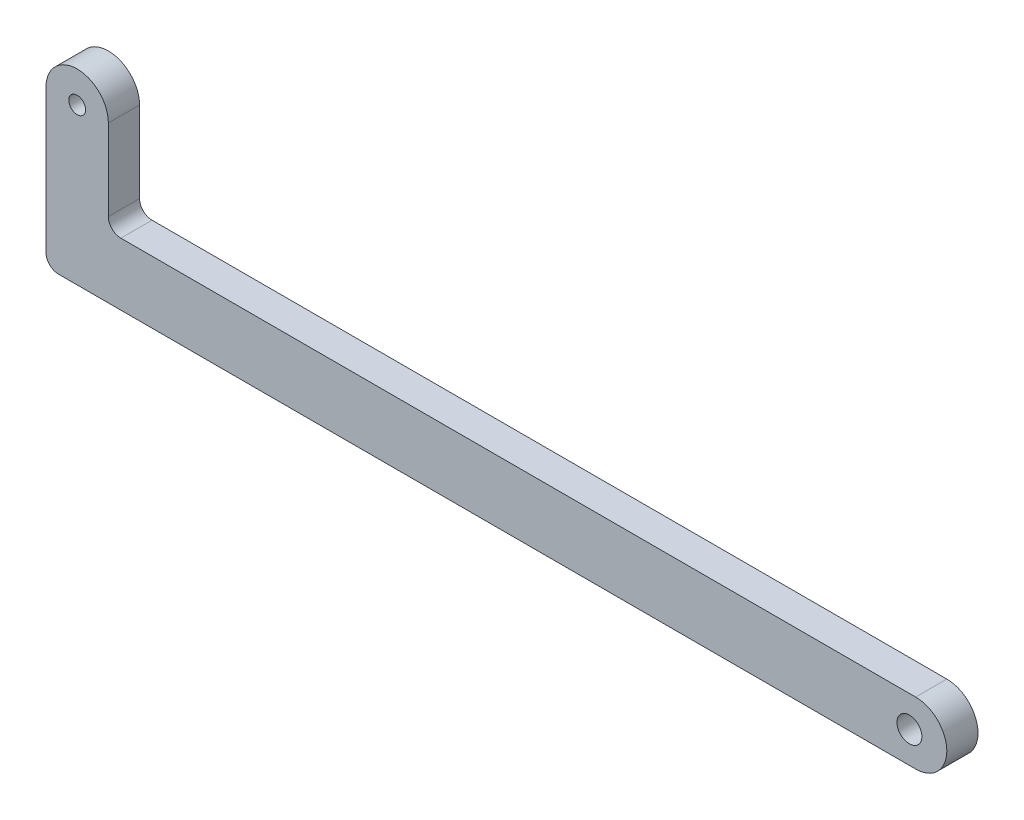
ISO-10303-21;
HEADER;
FILE_DESCRIPTION(('STEP AP214'),'2;1');
FILE_NAME('part.step','',(''),(''),'','','');
FILE_SCHEMA(('AUTOMOTIVE_DESIGN { 1 0 10303 214 1 1 1 1 }'));
ENDSEC;
DATA;
#1=APPLICATION_CONTEXT('core data for automotive mechanical design processes');
#2=APPLICATION_PROTOCOL_DEFINITION('international standard','automotive_design',2000,#1);
#3=PRODUCT_CONTEXT('',#1,'mechanical');
#4=PRODUCT('Part','Part','',(#3));
#5=PRODUCT_RELATED_PRODUCT_CATEGORY('part','',(#4));
#6=PRODUCT_DEFINITION_FORMATION('','',#4);
#7=PRODUCT_DEFINITION_CONTEXT('part definition',#1,'design');
#8=PRODUCT_DEFINITION('design','',#6,#7);
#9=PRODUCT_DEFINITION_SHAPE('','',#8);
#10=(LENGTH_UNIT() NAMED_UNIT(*) SI_UNIT(.MILLI.,.METRE.));
#11=(NAMED_UNIT(*) PLANE_ANGLE_UNIT() SI_UNIT($,.RADIAN.));
#12=(NAMED_UNIT(*) SI_UNIT($,.STERADIAN.) SOLID_ANGLE_UNIT());
#13=UNCERTAINTY_MEASURE_WITH_UNIT(LENGTH_MEASURE(1.E-05),#10,'distance_accuracy_value','');
#14=(GEOMETRIC_REPRESENTATION_CONTEXT(3) GLOBAL_UNCERTAINTY_ASSIGNED_CONTEXT((#13)) GLOBAL_UNIT_ASSIGNED_CONTEXT((#10,
#11,#12)) REPRESENTATION_CONTEXT('',''));
#15=CARTESIAN_POINT('',(0.,0.,0.));
#16=DIRECTION('',(0.,0.,1.));
#17=DIRECTION('',(1.,0.,0.));
#18=AXIS2_PLACEMENT_3D('',#15,#16,#17);
#19=CARTESIAN_POINT('',(12.,10.,5.));
#20=DIRECTION('',(0.,0.,-1.));
#21=DIRECTION('',(-1.,0.,0.));
#22=AXIS2_PLACEMENT_3D('',#19,#20,#21);
#23=PLANE('',#22);
#24=CARTESIAN_POINT('',(138.46079057,3.00000000000003,5.));
#25=DIRECTION('',(0.,0.,1.));
#26=DIRECTION('',(1.,0.,0.));
#27=AXIS2_PLACEMENT_3D('',#24,#25,#26);
#28=CIRCLE('',#27,2.);
#29=CARTESIAN_POINT('',(140.46079057,3.00000000000003,5.));
#30=VERTEX_POINT('',#29);
#31=EDGE_CURVE('E185',#30,#30,#28,.T.);
#32=ORIENTED_EDGE('',*,*,#31,.F.);
#33=EDGE_LOOP('',(#32));
#34=FACE_BOUND('',#33,.T.);
#35=CARTESIAN_POINT('',(12.,10.,5.));
#36=DIRECTION('',(0.,0.,-1.));
#37=DIRECTION('',(-1.,0.,0.));
#38=AXIS2_PLACEMENT_3D('',#35,#36,#37);
#39=CIRCLE('',#38,2.);
#40=CARTESIAN_POINT('',(12.,8.00000000000001,5.));
#41=VERTEX_POINT('',#40);
#42=CARTESIAN_POINT('',(9.99999999999999,10.,5.));
#43=VERTEX_POINT('',#42);
#44=EDGE_CURVE('E145',#41,#43,#39,.T.);
#45=ORIENTED_EDGE('',*,*,#44,.T.);
#46=DIRECTION('',(0.,1.,0.));
#47=VECTOR('',#46,1.);
#48=CARTESIAN_POINT('',(9.99999999999999,10.,5.));
#49=LINE('',#48,#47);
#50=CARTESIAN_POINT('',(9.99999999999999,23.,5.));
#51=VERTEX_POINT('',#50);
#52=EDGE_CURVE('E93',#43,#51,#49,.T.);
#53=ORIENTED_EDGE('',*,*,#52,.T.);
#54=CARTESIAN_POINT('',(4.99999999999999,23.,5.));
#55=DIRECTION('',(0.,0.,1.));
#56=DIRECTION('',(1.,0.,0.));
#57=AXIS2_PLACEMENT_3D('',#54,#55,#56);
#58=CIRCLE('',#57,5.);
#59=CARTESIAN_POINT('',(0.,23.,5.));
#60=VERTEX_POINT('',#59);
#61=EDGE_CURVE('E160',#51,#60,#58,.T.);
#62=ORIENTED_EDGE('',*,*,#61,.T.);
#63=DIRECTION('',(0.,-1.,0.));
#64=VECTOR('',#63,1.);
#65=CARTESIAN_POINT('',(0.,0.,5.));
#66=LINE('',#65,#64);
#67=CARTESIAN_POINT('',(0.,0.,5.));
#68=VERTEX_POINT('',#67);
#69=EDGE_CURVE('E173',#60,#68,#66,.T.);
#70=ORIENTED_EDGE('',*,*,#69,.T.);
#71=CARTESIAN_POINT('',(2.,0.,5.));
#72=DIRECTION('',(0.,0.,1.));
#73=DIRECTION('',(-1.,0.,0.));
#74=AXIS2_PLACEMENT_3D('',#71,#72,#73);
#75=CIRCLE('',#74,2.);
#76=CARTESIAN_POINT('',(2.,-2.,5.));
#77=VERTEX_POINT('',#76);
#78=EDGE_CURVE('E112',#68,#77,#75,.T.);
#79=ORIENTED_EDGE('',*,*,#78,.T.);
#80=DIRECTION('',(1.,0.,0.));
#81=VECTOR('',#80,1.);
#82=CARTESIAN_POINT('',(2.,-2.,5.));
#83=LINE('',#82,#81);
#84=CARTESIAN_POINT('',(139.46079057,-1.99999999999997,5.));
#85=VERTEX_POINT('',#84);
#86=EDGE_CURVE('E106',#77,#85,#83,.T.);
#87=ORIENTED_EDGE('',*,*,#86,.T.);
#88=CARTESIAN_POINT('',(139.46079057,3.00000000000003,5.));
#89=DIRECTION('',(0.,0.,1.));
#90=DIRECTION('',(1.,0.,0.));
#91=AXIS2_PLACEMENT_3D('',#88,#89,#90);
#92=CIRCLE('',#91,5.);
#93=CARTESIAN_POINT('',(139.46079057,8.00000000000003,5.));
#94=VERTEX_POINT('',#93);
#95=EDGE_CURVE('E110',#85,#94,#92,.T.);
#96=ORIENTED_EDGE('',*,*,#95,.T.);
#97=DIRECTION('',(-1.,0.,0.));
#98=VECTOR('',#97,1.);
#99=CARTESIAN_POINT('',(139.46079057,8.00000000000003,5.));
#100=LINE('',#99,#98);
#101=EDGE_CURVE('E50',#94,#41,#100,.T.);
#102=ORIENTED_EDGE('',*,*,#101,.T.);
#103=EDGE_LOOP('',(#45,#53,#62,#70,#79,#87,#96,#102));
#104=FACE_BOUND('',#103,.T.);
#105=CARTESIAN_POINT('',(4.99999999999999,23.,5.));
#106=DIRECTION('',(0.,0.,1.));
#107=DIRECTION('',(1.,0.,0.));
#108=AXIS2_PLACEMENT_3D('',#105,#106,#107);
#109=CIRCLE('',#108,1.35);
#110=CARTESIAN_POINT('',(6.35,23.,5.));
#111=VERTEX_POINT('',#110);
#112=EDGE_CURVE('E134',#111,#111,#109,.T.);
#113=ORIENTED_EDGE('',*,*,#112,.F.);
#114=EDGE_LOOP('',(#113));
#115=FACE_BOUND('',#114,.T.);
#116=ADVANCED_FACE('F33',(#34,#104,#115),#23,.F.);
#117=CARTESIAN_POINT('',(12.,10.,0.));
#118=DIRECTION('',(0.,0.,-1.));
#119=DIRECTION('',(-1.,0.,0.));
#120=AXIS2_PLACEMENT_3D('',#117,#118,#119);
#121=PLANE('',#120);
#122=CARTESIAN_POINT('',(138.46079057,3.00000000000003,0.));
#123=DIRECTION('',(0.,0.,1.));
#124=DIRECTION('',(1.,0.,0.));
#125=AXIS2_PLACEMENT_3D('',#122,#123,#124);
#126=CIRCLE('',#125,2.);
#127=CARTESIAN_POINT('',(140.46079057,3.00000000000003,0.));
#128=VERTEX_POINT('',#127);
#129=EDGE_CURVE('E182',#128,#128,#126,.T.);
#130=ORIENTED_EDGE('',*,*,#129,.T.);
#131=EDGE_LOOP('',(#130));
#132=FACE_BOUND('',#131,.T.);
#133=CARTESIAN_POINT('',(12.,10.,0.));
#134=DIRECTION('',(0.,0.,-1.));
#135=DIRECTION('',(-1.,0.,0.));
#136=AXIS2_PLACEMENT_3D('',#133,#134,#135);
#137=CIRCLE('',#136,2.);
#138=CARTESIAN_POINT('',(12.,8.00000000000001,0.));
#139=VERTEX_POINT('',#138);
#140=CARTESIAN_POINT('',(9.99999999999999,10.,0.));
#141=VERTEX_POINT('',#140);
#142=EDGE_CURVE('E130',#139,#141,#137,.T.);
#143=ORIENTED_EDGE('',*,*,#142,.F.);
#144=DIRECTION('',(-1.,0.,0.));
#145=VECTOR('',#144,1.);
#146=CARTESIAN_POINT('',(139.46079057,8.00000000000003,0.));
#147=LINE('',#146,#145);
#148=CARTESIAN_POINT('',(139.46079057,8.00000000000003,0.));
#149=VERTEX_POINT('',#148);
#150=EDGE_CURVE('E85',#149,#139,#147,.T.);
#151=ORIENTED_EDGE('',*,*,#150,.F.);
#152=CARTESIAN_POINT('',(139.46079057,3.00000000000003,0.));
#153=DIRECTION('',(0.,0.,1.));
#154=DIRECTION('',(1.,0.,0.));
#155=AXIS2_PLACEMENT_3D('',#152,#153,#154);
#156=CIRCLE('',#155,5.);
#157=CARTESIAN_POINT('',(139.46079057,-1.99999999999997,0.));
#158=VERTEX_POINT('',#157);
#159=EDGE_CURVE('E79',#158,#149,#156,.T.);
#160=ORIENTED_EDGE('',*,*,#159,.F.);
#161=DIRECTION('',(1.,0.,0.));
#162=VECTOR('',#161,1.);
#163=CARTESIAN_POINT('',(2.,-2.,0.));
#164=LINE('',#163,#162);
#165=CARTESIAN_POINT('',(2.,-2.,0.));
#166=VERTEX_POINT('',#165);
#167=EDGE_CURVE('E120',#166,#158,#164,.T.);
#168=ORIENTED_EDGE('',*,*,#167,.F.);
#169=CARTESIAN_POINT('',(2.,0.,0.));
#170=DIRECTION('',(0.,0.,1.));
#171=DIRECTION('',(-1.,0.,0.));
#172=AXIS2_PLACEMENT_3D('',#169,#170,#171);
#173=CIRCLE('',#172,2.);
#174=CARTESIAN_POINT('',(0.,0.,0.));
#175=VERTEX_POINT('',#174);
#176=EDGE_CURVE('E140',#175,#166,#173,.T.);
#177=ORIENTED_EDGE('',*,*,#176,.F.);
#178=DIRECTION('',(0.,-1.,0.));
#179=VECTOR('',#178,1.);
#180=CARTESIAN_POINT('',(0.,0.,0.));
#181=LINE('',#180,#179);
#182=CARTESIAN_POINT('',(0.,23.,0.));
#183=VERTEX_POINT('',#182);
#184=EDGE_CURVE('E138',#183,#175,#181,.T.);
#185=ORIENTED_EDGE('',*,*,#184,.F.);
#186=CARTESIAN_POINT('',(4.99999999999999,23.,0.));
#187=DIRECTION('',(0.,0.,1.));
#188=DIRECTION('',(1.,0.,0.));
#189=AXIS2_PLACEMENT_3D('',#186,#187,#188);
#190=CIRCLE('',#189,5.);
#191=CARTESIAN_POINT('',(9.99999999999999,23.,0.));
#192=VERTEX_POINT('',#191);
#193=EDGE_CURVE('E136',#192,#183,#190,.T.);
#194=ORIENTED_EDGE('',*,*,#193,.F.);
#195=DIRECTION('',(0.,1.,0.));
#196=VECTOR('',#195,1.);
#197=CARTESIAN_POINT('',(9.99999999999999,10.,0.));
#198=LINE('',#197,#196);
#199=EDGE_CURVE('E133',#141,#192,#198,.T.);
#200=ORIENTED_EDGE('',*,*,#199,.F.);
#201=EDGE_LOOP('',(#143,#151,#160,#168,#177,#185,#194,#200));
#202=FACE_BOUND('',#201,.T.);
#203=CARTESIAN_POINT('',(4.99999999999999,23.,0.));
#204=DIRECTION('',(0.,0.,1.));
#205=DIRECTION('',(1.,0.,0.));
#206=AXIS2_PLACEMENT_3D('',#203,#204,#205);
#207=CIRCLE('',#206,1.35);
#208=CARTESIAN_POINT('',(6.35,23.,0.));
#209=VERTEX_POINT('',#208);
#210=EDGE_CURVE('E179',#209,#209,#207,.T.);
#211=ORIENTED_EDGE('',*,*,#210,.T.);
#212=EDGE_LOOP('',(#211));
#213=FACE_BOUND('',#212,.T.);
#214=ADVANCED_FACE('F164',(#132,#202,#213),#121,.T.);
#215=CARTESIAN_POINT('',(12.,10.,5.));
#216=DIRECTION('',(0.,0.,-1.));
#217=DIRECTION('',(-1.,0.,0.));
#218=AXIS2_PLACEMENT_3D('',#215,#216,#217);
#219=CYLINDRICAL_SURFACE('',#218,2.);
#220=ORIENTED_EDGE('',*,*,#142,.T.);
#221=DIRECTION('',(0.,0.,-1.));
#222=VECTOR('',#221,1.);
#223=CARTESIAN_POINT('',(9.99999999999999,10.,5.));
#224=LINE('',#223,#222);
#225=EDGE_CURVE('E11',#43,#141,#224,.T.);
#226=ORIENTED_EDGE('',*,*,#225,.F.);
#227=ORIENTED_EDGE('',*,*,#44,.F.);
#228=DIRECTION('',(0.,0.,-1.));
#229=VECTOR('',#228,1.);
#230=CARTESIAN_POINT('',(12.,8.00000000000001,5.));
#231=LINE('',#230,#229);
#232=EDGE_CURVE('E126',#41,#139,#231,.T.);
#233=ORIENTED_EDGE('',*,*,#232,.T.);
#234=EDGE_LOOP('',(#220,#226,#227,#233));
#235=FACE_BOUND('',#234,.T.);
#236=ADVANCED_FACE('F35',(#235),#219,.F.);
#237=CARTESIAN_POINT('',(9.99999999999999,10.,5.));
#238=DIRECTION('',(-1.,0.,0.));
#239=DIRECTION('',(0.,0.,1.));
#240=AXIS2_PLACEMENT_3D('',#237,#238,#239);
#241=PLANE('',#240);
#242=ORIENTED_EDGE('',*,*,#199,.T.);
#243=DIRECTION('',(0.,0.,-1.));
#244=VECTOR('',#243,1.);
#245=CARTESIAN_POINT('',(9.99999999999999,23.,5.));
#246=LINE('',#245,#244);
#247=EDGE_CURVE('E42',#51,#192,#246,.T.);
#248=ORIENTED_EDGE('',*,*,#247,.F.);
#249=ORIENTED_EDGE('',*,*,#52,.F.);
#250=ORIENTED_EDGE('',*,*,#225,.T.);
#251=EDGE_LOOP('',(#242,#248,#249,#250));
#252=FACE_BOUND('',#251,.T.);
#253=ADVANCED_FACE('F219',(#252),#241,.F.);
#254=CARTESIAN_POINT('',(4.99999999999999,23.,5.));
#255=DIRECTION('',(0.,0.,-1.));
#256=DIRECTION('',(-1.,0.,0.));
#257=AXIS2_PLACEMENT_3D('',#254,#255,#256);
#258=CYLINDRICAL_SURFACE('',#257,5.);
#259=ORIENTED_EDGE('',*,*,#193,.T.);
#260=DIRECTION('',(0.,0.,-1.));
#261=VECTOR('',#260,1.);
#262=CARTESIAN_POINT('',(0.,23.,5.));
#263=LINE('',#262,#261);
#264=EDGE_CURVE('E152',#60,#183,#263,.T.);
#265=ORIENTED_EDGE('',*,*,#264,.F.);
#266=ORIENTED_EDGE('',*,*,#61,.F.);
#267=ORIENTED_EDGE('',*,*,#247,.T.);
#268=EDGE_LOOP('',(#259,#265,#266,#267));
#269=FACE_BOUND('',#268,.T.);
#270=ADVANCED_FACE('F158',(#269),#258,.T.);
#271=CARTESIAN_POINT('',(0.,0.,5.));
#272=DIRECTION('',(1.,0.,0.));
#273=DIRECTION('',(0.,1.,0.));
#274=AXIS2_PLACEMENT_3D('',#271,#272,#273);
#275=PLANE('',#274);
#276=ORIENTED_EDGE('',*,*,#184,.T.);
#277=DIRECTION('',(0.,0.,-1.));
#278=VECTOR('',#277,1.);
#279=CARTESIAN_POINT('',(0.,0.,5.));
#280=LINE('',#279,#278);
#281=EDGE_CURVE('E149',#68,#175,#280,.T.);
#282=ORIENTED_EDGE('',*,*,#281,.F.);
#283=ORIENTED_EDGE('',*,*,#69,.F.);
#284=ORIENTED_EDGE('',*,*,#264,.T.);
#285=EDGE_LOOP('',(#276,#282,#283,#284));
#286=FACE_BOUND('',#285,.T.);
#287=ADVANCED_FACE('F169',(#286),#275,.F.);
#288=CARTESIAN_POINT('',(2.,0.,5.));
#289=DIRECTION('',(0.,0.,-1.));
#290=DIRECTION('',(-1.,0.,0.));
#291=AXIS2_PLACEMENT_3D('',#288,#289,#290);
#292=CYLINDRICAL_SURFACE('',#291,2.);
#293=ORIENTED_EDGE('',*,*,#176,.T.);
#294=DIRECTION('',(0.,0.,-1.));
#295=VECTOR('',#294,1.);
#296=CARTESIAN_POINT('',(2.,-2.,5.));
#297=LINE('',#296,#295);
#298=EDGE_CURVE('E121',#77,#166,#297,.T.);
#299=ORIENTED_EDGE('',*,*,#298,.F.);
#300=ORIENTED_EDGE('',*,*,#78,.F.);
#301=ORIENTED_EDGE('',*,*,#281,.T.);
#302=EDGE_LOOP('',(#293,#299,#300,#301));
#303=FACE_BOUND('',#302,.T.);
#304=ADVANCED_FACE('F172',(#303),#292,.T.);
#305=CARTESIAN_POINT('',(2.,-2.,5.));
#306=DIRECTION('',(0.,1.,0.));
#307=DIRECTION('',(-1.,0.,0.));
#308=AXIS2_PLACEMENT_3D('',#305,#306,#307);
#309=PLANE('',#308);
#310=ORIENTED_EDGE('',*,*,#167,.T.);
#311=DIRECTION('',(0.,0.,-1.));
#312=VECTOR('',#311,1.);
#313=CARTESIAN_POINT('',(139.46079057,-1.99999999999997,5.));
#314=LINE('',#313,#312);
#315=EDGE_CURVE('E117',#85,#158,#314,.T.);
#316=ORIENTED_EDGE('',*,*,#315,.F.);
#317=ORIENTED_EDGE('',*,*,#86,.F.);
#318=ORIENTED_EDGE('',*,*,#298,.T.);
#319=EDGE_LOOP('',(#310,#316,#317,#318));
#320=FACE_BOUND('',#319,.T.);
#321=ADVANCED_FACE('F118',(#320),#309,.F.);
#322=CARTESIAN_POINT('',(139.46079057,3.00000000000003,5.));
#323=DIRECTION('',(0.,0.,-1.));
#324=DIRECTION('',(-1.,0.,0.));
#325=AXIS2_PLACEMENT_3D('',#322,#323,#324);
#326=CYLINDRICAL_SURFACE('',#325,5.);
#327=ORIENTED_EDGE('',*,*,#159,.T.);
#328=DIRECTION('',(0.,0.,-1.));
#329=VECTOR('',#328,1.);
#330=CARTESIAN_POINT('',(139.46079057,8.00000000000003,5.));
#331=LINE('',#330,#329);
#332=EDGE_CURVE('E122',#94,#149,#331,.T.);
#333=ORIENTED_EDGE('',*,*,#332,.F.);
#334=ORIENTED_EDGE('',*,*,#95,.F.);
#335=ORIENTED_EDGE('',*,*,#315,.T.);
#336=EDGE_LOOP('',(#327,#333,#334,#335));
#337=FACE_BOUND('',#336,.T.);
#338=ADVANCED_FACE('F124',(#337),#326,.T.);
#339=CARTESIAN_POINT('',(139.46079057,8.00000000000003,5.));
#340=DIRECTION('',(0.,-1.,0.));
#341=DIRECTION('',(1.,0.,0.));
#342=AXIS2_PLACEMENT_3D('',#339,#340,#341);
#343=PLANE('',#342);
#344=ORIENTED_EDGE('',*,*,#150,.T.);
#345=ORIENTED_EDGE('',*,*,#232,.F.);
#346=ORIENTED_EDGE('',*,*,#101,.F.);
#347=ORIENTED_EDGE('',*,*,#332,.T.);
#348=EDGE_LOOP('',(#344,#345,#346,#347));
#349=FACE_BOUND('',#348,.T.);
#350=ADVANCED_FACE('F207',(#349),#343,.F.);
#351=CARTESIAN_POINT('',(4.99999999999999,23.,5.));
#352=DIRECTION('',(0.,0.,-1.));
#353=DIRECTION('',(-1.,0.,0.));
#354=AXIS2_PLACEMENT_3D('',#351,#352,#353);
#355=CYLINDRICAL_SURFACE('',#354,1.35);
#356=ORIENTED_EDGE('',*,*,#112,.T.);
#357=EDGE_LOOP('',(#356));
#358=FACE_BOUND('',#357,.T.);
#359=ORIENTED_EDGE('',*,*,#210,.F.);
#360=EDGE_LOOP('',(#359));
#361=FACE_BOUND('',#360,.T.);
#362=ADVANCED_FACE('F195',(#358,#361),#355,.F.);
#363=CARTESIAN_POINT('',(138.46079057,3.00000000000003,0.));
#364=DIRECTION('',(0.,0.,1.));
#365=DIRECTION('',(1.,0.,0.));
#366=AXIS2_PLACEMENT_3D('',#363,#364,#365);
#367=CYLINDRICAL_SURFACE('',#366,2.);
#368=ORIENTED_EDGE('',*,*,#129,.F.);
#369=EDGE_LOOP('',(#368));
#370=FACE_BOUND('',#369,.T.);
#371=ORIENTED_EDGE('',*,*,#31,.T.);
#372=EDGE_LOOP('',(#371));
#373=FACE_BOUND('',#372,.T.);
#374=ADVANCED_FACE('F192',(#370,#373),#367,.F.);
#375=CLOSED_SHELL('',(#116,#214,#236,#253,#270,#287,#304,#321,#338,#350,#362,#374));
#376=MANIFOLD_SOLID_BREP('B2',#375);
#377=ADVANCED_BREP_SHAPE_REPRESENTATION('',(#18,#376),#14);
#378=SHAPE_DEFINITION_REPRESENTATION(#9,#377);
ENDSEC;
END-ISO-10303-21;
